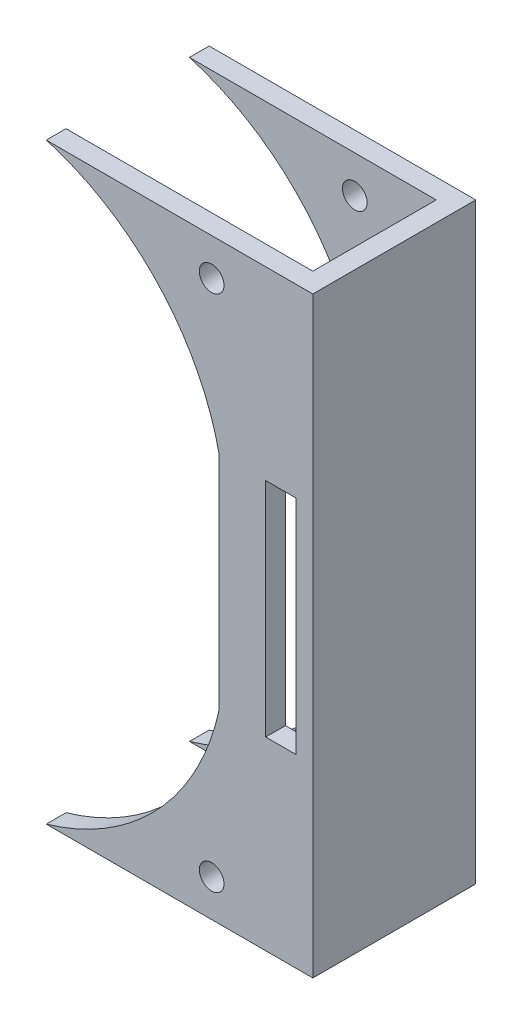
ISO-10303-21;
HEADER;
FILE_DESCRIPTION(('STEP AP214'),'2;1');
FILE_NAME('part.step','',(''),(''),'','','');
FILE_SCHEMA(('AUTOMOTIVE_DESIGN { 1 0 10303 214 1 1 1 1 }'));
ENDSEC;
DATA;
#1=APPLICATION_CONTEXT('core data for automotive mechanical design processes');
#2=APPLICATION_PROTOCOL_DEFINITION('international standard','automotive_design',2000,#1);
#3=PRODUCT_CONTEXT('',#1,'mechanical');
#4=PRODUCT('Part','Part','',(#3));
#5=PRODUCT_RELATED_PRODUCT_CATEGORY('part','',(#4));
#6=PRODUCT_DEFINITION_FORMATION('','',#4);
#7=PRODUCT_DEFINITION_CONTEXT('part definition',#1,'design');
#8=PRODUCT_DEFINITION('design','',#6,#7);
#9=PRODUCT_DEFINITION_SHAPE('','',#8);
#10=(LENGTH_UNIT() NAMED_UNIT(*) SI_UNIT(.MILLI.,.METRE.));
#11=(NAMED_UNIT(*) PLANE_ANGLE_UNIT() SI_UNIT($,.RADIAN.));
#12=(NAMED_UNIT(*) SI_UNIT($,.STERADIAN.) SOLID_ANGLE_UNIT());
#13=UNCERTAINTY_MEASURE_WITH_UNIT(LENGTH_MEASURE(1.E-05),#10,'distance_accuracy_value','');
#14=(GEOMETRIC_REPRESENTATION_CONTEXT(3) GLOBAL_UNCERTAINTY_ASSIGNED_CONTEXT((#13)) GLOBAL_UNIT_ASSIGNED_CONTEXT((#10,
#11,#12)) REPRESENTATION_CONTEXT('',''));
#15=CARTESIAN_POINT('',(0.,0.,0.));
#16=DIRECTION('',(0.,0.,1.));
#17=DIRECTION('',(1.,0.,0.));
#18=AXIS2_PLACEMENT_3D('',#15,#16,#17);
#19=CARTESIAN_POINT('',(27.3357664233577,0.,0.));
#20=DIRECTION('',(1.,0.,0.));
#21=DIRECTION('',(0.,1.,0.));
#22=AXIS2_PLACEMENT_3D('',#19,#20,#21);
#23=PLANE('',#22);
#24=DIRECTION('',(0.,-1.,0.));
#25=VECTOR('',#24,1.);
#26=CARTESIAN_POINT('',(27.3357664233577,0.,0.));
#27=LINE('',#26,#25);
#28=CARTESIAN_POINT('',(27.3357664233577,-22.5,0.));
#29=VERTEX_POINT('',#28);
#30=CARTESIAN_POINT('',(27.3357664233577,-60.,0.));
#31=VERTEX_POINT('',#30);
#32=EDGE_CURVE('E381',#29,#31,#27,.T.);
#33=ORIENTED_EDGE('',*,*,#32,.F.);
#34=DIRECTION('',(0.,0.,-1.));
#35=VECTOR('',#34,1.);
#36=CARTESIAN_POINT('',(27.3357664233577,-22.5,0.));
#37=LINE('',#36,#35);
#38=CARTESIAN_POINT('',(27.3357664233577,-22.5,-25.));
#39=VERTEX_POINT('',#38);
#40=EDGE_CURVE('E281',#29,#39,#37,.T.);
#41=ORIENTED_EDGE('',*,*,#40,.T.);
#42=DIRECTION('',(0.,-1.,0.));
#43=VECTOR('',#42,1.);
#44=CARTESIAN_POINT('',(27.3357664233577,0.,-25.));
#45=LINE('',#44,#43);
#46=CARTESIAN_POINT('',(27.3357664233577,-60.,-25.));
#47=VERTEX_POINT('',#46);
#48=EDGE_CURVE('E320',#39,#47,#45,.T.);
#49=ORIENTED_EDGE('',*,*,#48,.T.);
#50=DIRECTION('',(0.,0.,-1.));
#51=VECTOR('',#50,1.);
#52=CARTESIAN_POINT('',(27.3357664233577,-60.,4.));
#53=LINE('',#52,#51);
#54=EDGE_CURVE('E344',#31,#47,#53,.T.);
#55=ORIENTED_EDGE('',*,*,#54,.F.);
#56=EDGE_LOOP('',(#33,#41,#49,#55));
#57=FACE_BOUND('',#56,.T.);
#58=ADVANCED_FACE('F39',(#57),#23,.F.);
#59=CARTESIAN_POINT('',(27.3357664233576,60.,-25.));
#60=VERTEX_POINT('',#59);
#61=CARTESIAN_POINT('',(27.3357664233576,22.5,-25.));
#62=VERTEX_POINT('',#61);
#63=EDGE_CURVE('E321',#60,#62,#45,.T.);
#64=ORIENTED_EDGE('',*,*,#63,.T.);
#65=DIRECTION('',(0.,0.,1.));
#66=VECTOR('',#65,1.);
#67=CARTESIAN_POINT('',(27.3357664233576,22.5,0.));
#68=LINE('',#67,#66);
#69=CARTESIAN_POINT('',(27.3357664233576,22.5,0.));
#70=VERTEX_POINT('',#69);
#71=EDGE_CURVE('E262',#62,#70,#68,.T.);
#72=ORIENTED_EDGE('',*,*,#71,.T.);
#73=CARTESIAN_POINT('',(27.3357664233576,60.,0.));
#74=VERTEX_POINT('',#73);
#75=EDGE_CURVE('E382',#74,#70,#27,.T.);
#76=ORIENTED_EDGE('',*,*,#75,.F.);
#77=DIRECTION('',(0.,0.,1.));
#78=VECTOR('',#77,1.);
#79=CARTESIAN_POINT('',(27.3357664233576,60.,4.));
#80=LINE('',#79,#78);
#81=EDGE_CURVE('E349',#60,#74,#80,.T.);
#82=ORIENTED_EDGE('',*,*,#81,.F.);
#83=EDGE_LOOP('',(#64,#72,#76,#82));
#84=FACE_BOUND('',#83,.T.);
#85=ADVANCED_FACE('F428',(#84),#23,.F.);
#86=CARTESIAN_POINT('',(0.,-60.,4.));
#87=DIRECTION('',(0.,-1.,0.));
#88=DIRECTION('',(0.,0.,-1.));
#89=AXIS2_PLACEMENT_3D('',#86,#87,#88);
#90=PLANE('',#89);
#91=DIRECTION('',(-1.,0.,0.));
#92=VECTOR('',#91,1.);
#93=CARTESIAN_POINT('',(0.,-60.,0.));
#94=LINE('',#93,#92);
#95=CARTESIAN_POINT('',(-22.6642335766423,-60.,0.));
#96=VERTEX_POINT('',#95);
#97=EDGE_CURVE('E363',#31,#96,#94,.T.);
#98=ORIENTED_EDGE('',*,*,#97,.F.);
#99=ORIENTED_EDGE('',*,*,#54,.T.);
#100=DIRECTION('',(-1.,0.,0.));
#101=VECTOR('',#100,1.);
#102=CARTESIAN_POINT('',(0.,-60.,-25.));
#103=LINE('',#102,#101);
#104=CARTESIAN_POINT('',(-22.6642335766423,-60.,-25.));
#105=VERTEX_POINT('',#104);
#106=EDGE_CURVE('E307',#47,#105,#103,.T.);
#107=ORIENTED_EDGE('',*,*,#106,.T.);
#108=DIRECTION('',(0.,0.,1.));
#109=VECTOR('',#108,1.);
#110=CARTESIAN_POINT('',(-22.6642335766423,-60.,-29.));
#111=LINE('',#110,#109);
#112=CARTESIAN_POINT('',(-22.6642335766423,-60.,-29.));
#113=VERTEX_POINT('',#112);
#114=EDGE_CURVE('E317',#113,#105,#111,.T.);
#115=ORIENTED_EDGE('',*,*,#114,.F.);
#116=DIRECTION('',(-1.,0.,0.));
#117=VECTOR('',#116,1.);
#118=CARTESIAN_POINT('',(31.3357664233577,-60.,-29.));
#119=LINE('',#118,#117);
#120=CARTESIAN_POINT('',(31.3357664233577,-60.,-29.));
#121=VERTEX_POINT('',#120);
#122=EDGE_CURVE('E361',#121,#113,#119,.T.);
#123=ORIENTED_EDGE('',*,*,#122,.F.);
#124=DIRECTION('',(0.,0.,-1.));
#125=VECTOR('',#124,1.);
#126=CARTESIAN_POINT('',(31.3357664233577,-60.,4.));
#127=LINE('',#126,#125);
#128=CARTESIAN_POINT('',(31.3357664233577,-60.,4.));
#129=VERTEX_POINT('',#128);
#130=EDGE_CURVE('E348',#129,#121,#127,.T.);
#131=ORIENTED_EDGE('',*,*,#130,.F.);
#132=DIRECTION('',(-1.,0.,0.));
#133=VECTOR('',#132,1.);
#134=CARTESIAN_POINT('',(0.,-60.,4.));
#135=LINE('',#134,#133);
#136=CARTESIAN_POINT('',(-22.6642335766423,-60.,4.));
#137=VERTEX_POINT('',#136);
#138=EDGE_CURVE('E364',#129,#137,#135,.T.);
#139=ORIENTED_EDGE('',*,*,#138,.T.);
#140=DIRECTION('',(0.,0.,-1.));
#141=VECTOR('',#140,1.);
#142=CARTESIAN_POINT('',(-22.6642335766423,-60.,4.));
#143=LINE('',#142,#141);
#144=EDGE_CURVE('E378',#137,#96,#143,.T.);
#145=ORIENTED_EDGE('',*,*,#144,.T.);
#146=EDGE_LOOP('',(#98,#99,#107,#115,#123,#131,#139,#145));
#147=FACE_BOUND('',#146,.T.);
#148=ADVANCED_FACE('F41',(#147),#90,.T.);
#149=CARTESIAN_POINT('',(0.,60.,4.));
#150=DIRECTION('',(0.,1.,0.));
#151=DIRECTION('',(0.,0.,1.));
#152=AXIS2_PLACEMENT_3D('',#149,#150,#151);
#153=PLANE('',#152);
#154=DIRECTION('',(1.,0.,0.));
#155=VECTOR('',#154,1.);
#156=CARTESIAN_POINT('',(0.,60.,0.));
#157=LINE('',#156,#155);
#158=CARTESIAN_POINT('',(-22.6642335766424,60.,0.));
#159=VERTEX_POINT('',#158);
#160=EDGE_CURVE('E385',#159,#74,#157,.T.);
#161=ORIENTED_EDGE('',*,*,#160,.F.);
#162=DIRECTION('',(0.,0.,-1.));
#163=VECTOR('',#162,1.);
#164=CARTESIAN_POINT('',(-22.6642335766424,60.,4.));
#165=LINE('',#164,#163);
#166=CARTESIAN_POINT('',(-22.6642335766424,60.,4.));
#167=VERTEX_POINT('',#166);
#168=EDGE_CURVE('E401',#167,#159,#165,.T.);
#169=ORIENTED_EDGE('',*,*,#168,.F.);
#170=DIRECTION('',(1.,0.,0.));
#171=VECTOR('',#170,1.);
#172=CARTESIAN_POINT('',(0.,60.,4.));
#173=LINE('',#172,#171);
#174=CARTESIAN_POINT('',(31.3357664233576,60.,4.));
#175=VERTEX_POINT('',#174);
#176=EDGE_CURVE('E367',#167,#175,#173,.T.);
#177=ORIENTED_EDGE('',*,*,#176,.T.);
#178=DIRECTION('',(0.,0.,1.));
#179=VECTOR('',#178,1.);
#180=CARTESIAN_POINT('',(31.3357664233576,60.,4.));
#181=LINE('',#180,#179);
#182=CARTESIAN_POINT('',(31.3357664233576,60.,-29.));
#183=VERTEX_POINT('',#182);
#184=EDGE_CURVE('E353',#183,#175,#181,.T.);
#185=ORIENTED_EDGE('',*,*,#184,.F.);
#186=DIRECTION('',(-1.,0.,0.));
#187=VECTOR('',#186,1.);
#188=CARTESIAN_POINT('',(31.3357664233576,60.,-29.));
#189=LINE('',#188,#187);
#190=CARTESIAN_POINT('',(-22.6642335766424,60.,-29.));
#191=VERTEX_POINT('',#190);
#192=EDGE_CURVE('E356',#183,#191,#189,.T.);
#193=ORIENTED_EDGE('',*,*,#192,.T.);
#194=DIRECTION('',(0.,0.,1.));
#195=VECTOR('',#194,1.);
#196=CARTESIAN_POINT('',(-22.6642335766424,60.,-29.));
#197=LINE('',#196,#195);
#198=CARTESIAN_POINT('',(-22.6642335766424,60.,-25.));
#199=VERTEX_POINT('',#198);
#200=EDGE_CURVE('E341',#191,#199,#197,.T.);
#201=ORIENTED_EDGE('',*,*,#200,.T.);
#202=DIRECTION('',(1.,0.,0.));
#203=VECTOR('',#202,1.);
#204=CARTESIAN_POINT('',(0.,60.,-25.));
#205=LINE('',#204,#203);
#206=EDGE_CURVE('E324',#199,#60,#205,.T.);
#207=ORIENTED_EDGE('',*,*,#206,.T.);
#208=ORIENTED_EDGE('',*,*,#81,.T.);
#209=EDGE_LOOP('',(#161,#169,#177,#185,#193,#201,#207,#208));
#210=FACE_BOUND('',#209,.T.);
#211=ADVANCED_FACE('F435',(#210),#153,.T.);
#212=CARTESIAN_POINT('',(-36.6773985314371,11.8377127088582,4.));
#213=DIRECTION('',(0.,0.,-1.));
#214=DIRECTION('',(-1.,0.,0.));
#215=AXIS2_PLACEMENT_3D('',#212,#213,#214);
#216=CYLINDRICAL_SURFACE('',#215,50.1594927123946);
#217=CARTESIAN_POINT('',(-36.6773985314371,11.8377127088582,0.));
#218=DIRECTION('',(0.,0.,1.));
#219=DIRECTION('',(1.,0.,0.));
#220=AXIS2_PLACEMENT_3D('',#217,#218,#219);
#221=CIRCLE('',#220,50.1594927123946);
#222=CARTESIAN_POINT('',(12.3357664233576,22.5,0.));
#223=VERTEX_POINT('',#222);
#224=EDGE_CURVE('E388',#223,#159,#221,.T.);
#225=ORIENTED_EDGE('',*,*,#224,.F.);
#226=DIRECTION('',(0.,0.,-1.));
#227=VECTOR('',#226,1.);
#228=CARTESIAN_POINT('',(12.3357664233576,22.5,4.));
#229=LINE('',#228,#227);
#230=CARTESIAN_POINT('',(12.3357664233576,22.5,4.));
#231=VERTEX_POINT('',#230);
#232=EDGE_CURVE('E399',#231,#223,#229,.T.);
#233=ORIENTED_EDGE('',*,*,#232,.F.);
#234=CARTESIAN_POINT('',(-36.6773985314371,11.8377127088582,4.));
#235=DIRECTION('',(0.,0.,1.));
#236=DIRECTION('',(1.,0.,0.));
#237=AXIS2_PLACEMENT_3D('',#234,#235,#236);
#238=CIRCLE('',#237,50.1594927123946);
#239=EDGE_CURVE('E370',#231,#167,#238,.T.);
#240=ORIENTED_EDGE('',*,*,#239,.T.);
#241=ORIENTED_EDGE('',*,*,#168,.T.);
#242=EDGE_LOOP('',(#225,#233,#240,#241));
#243=FACE_BOUND('',#242,.T.);
#244=ADVANCED_FACE('F503',(#243),#216,.F.);
#245=CARTESIAN_POINT('',(12.3357664233576,0.,4.));
#246=DIRECTION('',(1.,0.,0.));
#247=DIRECTION('',(0.,1.,0.));
#248=AXIS2_PLACEMENT_3D('',#245,#246,#247);
#249=PLANE('',#248);
#250=DIRECTION('',(0.,-1.,0.));
#251=VECTOR('',#250,1.);
#252=CARTESIAN_POINT('',(12.3357664233576,0.,0.));
#253=LINE('',#252,#251);
#254=CARTESIAN_POINT('',(12.3357664233577,-22.5,0.));
#255=VERTEX_POINT('',#254);
#256=EDGE_CURVE('E391',#223,#255,#253,.T.);
#257=ORIENTED_EDGE('',*,*,#256,.T.);
#258=DIRECTION('',(0.,0.,-1.));
#259=VECTOR('',#258,1.);
#260=CARTESIAN_POINT('',(12.3357664233577,-22.5,4.));
#261=LINE('',#260,#259);
#262=CARTESIAN_POINT('',(12.3357664233577,-22.5,4.));
#263=VERTEX_POINT('',#262);
#264=EDGE_CURVE('E397',#263,#255,#261,.T.);
#265=ORIENTED_EDGE('',*,*,#264,.F.);
#266=DIRECTION('',(0.,-1.,0.));
#267=VECTOR('',#266,1.);
#268=CARTESIAN_POINT('',(12.3357664233576,0.,4.));
#269=LINE('',#268,#267);
#270=EDGE_CURVE('E373',#231,#263,#269,.T.);
#271=ORIENTED_EDGE('',*,*,#270,.F.);
#272=ORIENTED_EDGE('',*,*,#232,.T.);
#273=EDGE_LOOP('',(#257,#265,#271,#272));
#274=FACE_BOUND('',#273,.T.);
#275=ADVANCED_FACE('F499',(#274),#249,.F.);
#276=CARTESIAN_POINT('',(-36.6773985314372,-11.8377127088581,4.));
#277=DIRECTION('',(0.,0.,-1.));
#278=DIRECTION('',(-1.,0.,0.));
#279=AXIS2_PLACEMENT_3D('',#276,#277,#278);
#280=CYLINDRICAL_SURFACE('',#279,50.1594927123947);
#281=CARTESIAN_POINT('',(-36.6773985314372,-11.8377127088581,0.));
#282=DIRECTION('',(0.,0.,1.));
#283=DIRECTION('',(1.,0.,0.));
#284=AXIS2_PLACEMENT_3D('',#281,#282,#283);
#285=CIRCLE('',#284,50.1594927123947);
#286=EDGE_CURVE('E368',#96,#255,#285,.T.);
#287=ORIENTED_EDGE('',*,*,#286,.F.);
#288=ORIENTED_EDGE('',*,*,#144,.F.);
#289=CARTESIAN_POINT('',(-36.6773985314372,-11.8377127088581,4.));
#290=DIRECTION('',(0.,0.,1.));
#291=DIRECTION('',(1.,0.,0.));
#292=AXIS2_PLACEMENT_3D('',#289,#290,#291);
#293=CIRCLE('',#292,50.1594927123947);
#294=EDGE_CURVE('E375',#137,#263,#293,.T.);
#295=ORIENTED_EDGE('',*,*,#294,.T.);
#296=ORIENTED_EDGE('',*,*,#264,.T.);
#297=EDGE_LOOP('',(#287,#288,#295,#296));
#298=FACE_BOUND('',#297,.T.);
#299=ADVANCED_FACE('F493',(#298),#280,.F.);
#300=CARTESIAN_POINT('',(0.,0.,4.));
#301=DIRECTION('',(0.,0.,1.));
#302=DIRECTION('',(1.,0.,0.));
#303=AXIS2_PLACEMENT_3D('',#300,#301,#302);
#304=PLANE('',#303);
#305=DIRECTION('',(0.,1.,0.));
#306=VECTOR('',#305,1.);
#307=CARTESIAN_POINT('',(27.8871736605776,-22.5,4.));
#308=LINE('',#307,#306);
#309=CARTESIAN_POINT('',(27.8871736605776,-22.5,4.));
#310=VERTEX_POINT('',#309);
#311=CARTESIAN_POINT('',(27.8871736605776,22.5,4.));
#312=VERTEX_POINT('',#311);
#313=EDGE_CURVE('E233',#310,#312,#308,.T.);
#314=ORIENTED_EDGE('',*,*,#313,.F.);
#315=DIRECTION('',(1.,0.,0.));
#316=VECTOR('',#315,1.);
#317=CARTESIAN_POINT('',(21.7843591861376,-22.5,4.));
#318=LINE('',#317,#316);
#319=CARTESIAN_POINT('',(21.7843591861376,-22.5,4.));
#320=VERTEX_POINT('',#319);
#321=EDGE_CURVE('E241',#320,#310,#318,.T.);
#322=ORIENTED_EDGE('',*,*,#321,.F.);
#323=DIRECTION('',(0.,-1.,0.));
#324=VECTOR('',#323,1.);
#325=CARTESIAN_POINT('',(21.7843591861376,-22.5,4.));
#326=LINE('',#325,#324);
#327=CARTESIAN_POINT('',(21.7843591861376,22.5,4.));
#328=VERTEX_POINT('',#327);
#329=EDGE_CURVE('E255',#328,#320,#326,.T.);
#330=ORIENTED_EDGE('',*,*,#329,.F.);
#331=DIRECTION('',(-1.,0.,0.));
#332=VECTOR('',#331,1.);
#333=CARTESIAN_POINT('',(21.7843591861376,22.5,4.));
#334=LINE('',#333,#332);
#335=EDGE_CURVE('E252',#312,#328,#334,.T.);
#336=ORIENTED_EDGE('',*,*,#335,.F.);
#337=EDGE_LOOP('',(#314,#322,#330,#336));
#338=FACE_BOUND('',#337,.T.);
#339=CARTESIAN_POINT('',(10.8357664233576,-52.5,4.));
#340=DIRECTION('',(0.,0.,-1.));
#341=DIRECTION('',(1.,0.,0.));
#342=AXIS2_PLACEMENT_3D('',#339,#340,#341);
#343=CIRCLE('',#342,2.5);
#344=CARTESIAN_POINT('',(13.3357664233576,-52.5,4.));
#345=VERTEX_POINT('',#344);
#346=EDGE_CURVE('E287',#345,#345,#343,.T.);
#347=ORIENTED_EDGE('',*,*,#346,.T.);
#348=EDGE_LOOP('',(#347));
#349=FACE_BOUND('',#348,.T.);
#350=CARTESIAN_POINT('',(10.8357664233576,52.5,4.));
#351=DIRECTION('',(0.,0.,1.));
#352=DIRECTION('',(1.,0.,0.));
#353=AXIS2_PLACEMENT_3D('',#350,#351,#352);
#354=CIRCLE('',#353,2.5);
#355=CARTESIAN_POINT('',(13.3357664233576,52.5,4.));
#356=VERTEX_POINT('',#355);
#357=EDGE_CURVE('E297',#356,#356,#354,.T.);
#358=ORIENTED_EDGE('',*,*,#357,.F.);
#359=EDGE_LOOP('',(#358));
#360=FACE_BOUND('',#359,.T.);
#361=ORIENTED_EDGE('',*,*,#138,.F.);
#362=DIRECTION('',(0.,-1.,0.));
#363=VECTOR('',#362,1.);
#364=CARTESIAN_POINT('',(31.3357664233576,60.,4.));
#365=LINE('',#364,#363);
#366=EDGE_CURVE('E345',#175,#129,#365,.T.);
#367=ORIENTED_EDGE('',*,*,#366,.F.);
#368=ORIENTED_EDGE('',*,*,#176,.F.);
#369=ORIENTED_EDGE('',*,*,#239,.F.);
#370=ORIENTED_EDGE('',*,*,#270,.T.);
#371=ORIENTED_EDGE('',*,*,#294,.F.);
#372=EDGE_LOOP('',(#361,#367,#368,#369,#370,#371));
#373=FACE_BOUND('',#372,.T.);
#374=ADVANCED_FACE('F466',(#338,#349,#360,#373),#304,.T.);
#375=CARTESIAN_POINT('',(0.,0.,0.));
#376=DIRECTION('',(0.,0.,1.));
#377=DIRECTION('',(1.,0.,0.));
#378=AXIS2_PLACEMENT_3D('',#375,#376,#377);
#379=PLANE('',#378);
#380=CARTESIAN_POINT('',(10.8357664233576,-52.5,0.));
#381=DIRECTION('',(0.,0.,1.));
#382=DIRECTION('',(1.,0.,0.));
#383=AXIS2_PLACEMENT_3D('',#380,#381,#382);
#384=CIRCLE('',#383,2.5);
#385=CARTESIAN_POINT('',(13.3357664233576,-52.5,0.));
#386=VERTEX_POINT('',#385);
#387=EDGE_CURVE('E294',#386,#386,#384,.F.);
#388=ORIENTED_EDGE('',*,*,#387,.F.);
#389=EDGE_LOOP('',(#388));
#390=FACE_BOUND('',#389,.T.);
#391=CARTESIAN_POINT('',(10.8357664233576,52.5,0.));
#392=DIRECTION('',(0.,0.,1.));
#393=DIRECTION('',(1.,0.,0.));
#394=AXIS2_PLACEMENT_3D('',#391,#392,#393);
#395=CIRCLE('',#394,2.5);
#396=CARTESIAN_POINT('',(13.3357664233576,52.5,0.));
#397=VERTEX_POINT('',#396);
#398=EDGE_CURVE('E304',#397,#397,#395,.T.);
#399=ORIENTED_EDGE('',*,*,#398,.T.);
#400=EDGE_LOOP('',(#399));
#401=FACE_BOUND('',#400,.T.);
#402=DIRECTION('',(0.,-1.,0.));
#403=VECTOR('',#402,1.);
#404=CARTESIAN_POINT('',(21.7843591861376,0.,0.));
#405=LINE('',#404,#403);
#406=CARTESIAN_POINT('',(21.7843591861376,22.5,0.));
#407=VERTEX_POINT('',#406);
#408=CARTESIAN_POINT('',(21.7843591861376,-22.5,0.));
#409=VERTEX_POINT('',#408);
#410=EDGE_CURVE('E278',#407,#409,#405,.T.);
#411=ORIENTED_EDGE('',*,*,#410,.T.);
#412=DIRECTION('',(1.,0.,0.));
#413=VECTOR('',#412,1.);
#414=CARTESIAN_POINT('',(0.,-22.5,0.));
#415=LINE('',#414,#413);
#416=EDGE_CURVE('E284',#409,#29,#415,.T.);
#417=ORIENTED_EDGE('',*,*,#416,.T.);
#418=ORIENTED_EDGE('',*,*,#32,.T.);
#419=ORIENTED_EDGE('',*,*,#97,.T.);
#420=ORIENTED_EDGE('',*,*,#286,.T.);
#421=ORIENTED_EDGE('',*,*,#256,.F.);
#422=ORIENTED_EDGE('',*,*,#224,.T.);
#423=ORIENTED_EDGE('',*,*,#160,.T.);
#424=ORIENTED_EDGE('',*,*,#75,.T.);
#425=DIRECTION('',(-1.,0.,0.));
#426=VECTOR('',#425,1.);
#427=CARTESIAN_POINT('',(0.,22.5,0.));
#428=LINE('',#427,#426);
#429=EDGE_CURVE('E275',#70,#407,#428,.T.);
#430=ORIENTED_EDGE('',*,*,#429,.T.);
#431=EDGE_LOOP('',(#411,#417,#418,#419,#420,#421,#422,#423,#424,#430));
#432=FACE_BOUND('',#431,.T.);
#433=ADVANCED_FACE('F430',(#390,#401,#432),#379,.F.);
#434=CARTESIAN_POINT('',(31.3357664233576,60.,-29.));
#435=DIRECTION('',(0.,0.,1.));
#436=DIRECTION('',(0.,-1.,0.));
#437=AXIS2_PLACEMENT_3D('',#434,#435,#436);
#438=PLANE('',#437);
#439=DIRECTION('',(1.,0.,0.));
#440=VECTOR('',#439,1.);
#441=CARTESIAN_POINT('',(14.3357664233576,-41.5,-29.));
#442=LINE('',#441,#440);
#443=CARTESIAN_POINT('',(14.3357664233576,-41.5,-29.));
#444=VERTEX_POINT('',#443);
#445=CARTESIAN_POINT('',(21.8357664233576,-41.5,-29.));
#446=VERTEX_POINT('',#445);
#447=EDGE_CURVE('E208',#444,#446,#442,.T.);
#448=ORIENTED_EDGE('',*,*,#447,.T.);
#449=DIRECTION('',(0.,1.,0.));
#450=VECTOR('',#449,1.);
#451=CARTESIAN_POINT('',(21.8357664233576,-41.5,-29.));
#452=LINE('',#451,#450);
#453=CARTESIAN_POINT('',(21.8357664233576,-35.5,-29.));
#454=VERTEX_POINT('',#453);
#455=EDGE_CURVE('E202',#446,#454,#452,.T.);
#456=ORIENTED_EDGE('',*,*,#455,.T.);
#457=DIRECTION('',(-1.,0.,0.));
#458=VECTOR('',#457,1.);
#459=CARTESIAN_POINT('',(14.3357664233576,-35.5,-29.));
#460=LINE('',#459,#458);
#461=CARTESIAN_POINT('',(14.3357664233576,-35.5,-29.));
#462=VERTEX_POINT('',#461);
#463=EDGE_CURVE('E211',#454,#462,#460,.T.);
#464=ORIENTED_EDGE('',*,*,#463,.T.);
#465=DIRECTION('',(0.,-1.,0.));
#466=VECTOR('',#465,1.);
#467=CARTESIAN_POINT('',(14.3357664233576,-41.5,-29.));
#468=LINE('',#467,#466);
#469=EDGE_CURVE('E54',#462,#444,#468,.T.);
#470=ORIENTED_EDGE('',*,*,#469,.T.);
#471=EDGE_LOOP('',(#448,#456,#464,#470));
#472=FACE_BOUND('',#471,.T.);
#473=DIRECTION('',(1.,0.,0.));
#474=VECTOR('',#473,1.);
#475=CARTESIAN_POINT('',(21.7843591861376,-22.5,-29.));
#476=LINE('',#475,#474);
#477=CARTESIAN_POINT('',(21.7843591861376,-22.5,-29.));
#478=VERTEX_POINT('',#477);
#479=CARTESIAN_POINT('',(27.8871736605776,-22.5,-29.));
#480=VERTEX_POINT('',#479);
#481=EDGE_CURVE('E247',#478,#480,#476,.T.);
#482=ORIENTED_EDGE('',*,*,#481,.T.);
#483=DIRECTION('',(0.,1.,0.));
#484=VECTOR('',#483,1.);
#485=CARTESIAN_POINT('',(27.8871736605776,-22.5,-29.));
#486=LINE('',#485,#484);
#487=CARTESIAN_POINT('',(27.8871736605776,22.5,-29.));
#488=VERTEX_POINT('',#487);
#489=EDGE_CURVE('E237',#480,#488,#486,.T.);
#490=ORIENTED_EDGE('',*,*,#489,.T.);
#491=DIRECTION('',(-1.,0.,0.));
#492=VECTOR('',#491,1.);
#493=CARTESIAN_POINT('',(21.7843591861376,22.5,-29.));
#494=LINE('',#493,#492);
#495=CARTESIAN_POINT('',(21.7843591861376,22.5,-29.));
#496=VERTEX_POINT('',#495);
#497=EDGE_CURVE('E240',#488,#496,#494,.T.);
#498=ORIENTED_EDGE('',*,*,#497,.T.);
#499=DIRECTION('',(0.,-1.,0.));
#500=VECTOR('',#499,1.);
#501=CARTESIAN_POINT('',(21.7843591861376,-22.5,-29.));
#502=LINE('',#501,#500);
#503=EDGE_CURVE('E244',#496,#478,#502,.T.);
#504=ORIENTED_EDGE('',*,*,#503,.T.);
#505=EDGE_LOOP('',(#482,#490,#498,#504));
#506=FACE_BOUND('',#505,.T.);
#507=CARTESIAN_POINT('',(10.8357664233576,-52.5,-29.));
#508=DIRECTION('',(0.,0.,-1.));
#509=DIRECTION('',(1.,0.,0.));
#510=AXIS2_PLACEMENT_3D('',#507,#508,#509);
#511=CIRCLE('',#510,2.5);
#512=CARTESIAN_POINT('',(13.3357664233576,-52.5,-29.));
#513=VERTEX_POINT('',#512);
#514=EDGE_CURVE('E288',#513,#513,#511,.T.);
#515=ORIENTED_EDGE('',*,*,#514,.F.);
#516=EDGE_LOOP('',(#515));
#517=FACE_BOUND('',#516,.T.);
#518=CARTESIAN_POINT('',(10.8357664233576,52.5,-29.));
#519=DIRECTION('',(0.,0.,1.));
#520=DIRECTION('',(1.,0.,0.));
#521=AXIS2_PLACEMENT_3D('',#518,#519,#520);
#522=CIRCLE('',#521,2.5);
#523=CARTESIAN_POINT('',(13.3357664233576,52.5,-29.));
#524=VERTEX_POINT('',#523);
#525=EDGE_CURVE('E298',#524,#524,#522,.T.);
#526=ORIENTED_EDGE('',*,*,#525,.T.);
#527=EDGE_LOOP('',(#526));
#528=FACE_BOUND('',#527,.T.);
#529=ORIENTED_EDGE('',*,*,#122,.T.);
#530=CARTESIAN_POINT('',(-36.6773985314372,-11.8377127088581,-29.));
#531=DIRECTION('',(0.,0.,1.));
#532=DIRECTION('',(1.,0.,0.));
#533=AXIS2_PLACEMENT_3D('',#530,#531,#532);
#534=CIRCLE('',#533,50.1594927123947);
#535=CARTESIAN_POINT('',(12.3357664233577,-22.5,-29.));
#536=VERTEX_POINT('',#535);
#537=EDGE_CURVE('E315',#113,#536,#534,.T.);
#538=ORIENTED_EDGE('',*,*,#537,.T.);
#539=DIRECTION('',(0.,-1.,0.));
#540=VECTOR('',#539,1.);
#541=CARTESIAN_POINT('',(12.3357664233576,0.,-29.));
#542=LINE('',#541,#540);
#543=CARTESIAN_POINT('',(12.3357664233576,22.5,-29.));
#544=VERTEX_POINT('',#543);
#545=EDGE_CURVE('E311',#544,#536,#542,.T.);
#546=ORIENTED_EDGE('',*,*,#545,.F.);
#547=CARTESIAN_POINT('',(-36.6773985314371,11.8377127088582,-29.));
#548=DIRECTION('',(0.,0.,1.));
#549=DIRECTION('',(1.,0.,0.));
#550=AXIS2_PLACEMENT_3D('',#547,#548,#549);
#551=CIRCLE('',#550,50.1594927123946);
#552=EDGE_CURVE('E308',#544,#191,#551,.T.);
#553=ORIENTED_EDGE('',*,*,#552,.T.);
#554=ORIENTED_EDGE('',*,*,#192,.F.);
#555=DIRECTION('',(0.,1.,0.));
#556=VECTOR('',#555,1.);
#557=CARTESIAN_POINT('',(31.3357664233576,60.,-29.));
#558=LINE('',#557,#556);
#559=EDGE_CURVE('E351',#121,#183,#558,.T.);
#560=ORIENTED_EDGE('',*,*,#559,.F.);
#561=EDGE_LOOP('',(#529,#538,#546,#553,#554,#560));
#562=FACE_BOUND('',#561,.T.);
#563=ADVANCED_FACE('F215',(#472,#506,#517,#528,#562),#438,.F.);
#564=CARTESIAN_POINT('',(31.3357664233577,0.,0.));
#565=DIRECTION('',(1.,0.,0.));
#566=DIRECTION('',(0.,1.,0.));
#567=AXIS2_PLACEMENT_3D('',#564,#565,#566);
#568=PLANE('',#567);
#569=ORIENTED_EDGE('',*,*,#366,.T.);
#570=ORIENTED_EDGE('',*,*,#130,.T.);
#571=ORIENTED_EDGE('',*,*,#559,.T.);
#572=ORIENTED_EDGE('',*,*,#184,.T.);
#573=EDGE_LOOP('',(#569,#570,#571,#572));
#574=FACE_BOUND('',#573,.T.);
#575=ADVANCED_FACE('F487',(#574),#568,.T.);
#576=CARTESIAN_POINT('',(-36.6773985314371,11.8377127088582,-29.));
#577=DIRECTION('',(0.,0.,1.));
#578=DIRECTION('',(-1.,0.,0.));
#579=AXIS2_PLACEMENT_3D('',#576,#577,#578);
#580=CYLINDRICAL_SURFACE('',#579,50.1594927123946);
#581=CARTESIAN_POINT('',(-36.6773985314371,11.8377127088582,-25.));
#582=DIRECTION('',(0.,0.,1.));
#583=DIRECTION('',(1.,0.,0.));
#584=AXIS2_PLACEMENT_3D('',#581,#582,#583);
#585=CIRCLE('',#584,50.1594927123946);
#586=CARTESIAN_POINT('',(12.3357664233576,22.5,-25.));
#587=VERTEX_POINT('',#586);
#588=EDGE_CURVE('E327',#587,#199,#585,.T.);
#589=ORIENTED_EDGE('',*,*,#588,.T.);
#590=ORIENTED_EDGE('',*,*,#200,.F.);
#591=ORIENTED_EDGE('',*,*,#552,.F.);
#592=DIRECTION('',(0.,0.,1.));
#593=VECTOR('',#592,1.);
#594=CARTESIAN_POINT('',(12.3357664233576,22.5,-29.));
#595=LINE('',#594,#593);
#596=EDGE_CURVE('E338',#544,#587,#595,.T.);
#597=ORIENTED_EDGE('',*,*,#596,.T.);
#598=EDGE_LOOP('',(#589,#590,#591,#597));
#599=FACE_BOUND('',#598,.T.);
#600=ADVANCED_FACE('F441',(#599),#580,.F.);
#601=CARTESIAN_POINT('',(12.3357664233576,0.,-29.));
#602=DIRECTION('',(1.,0.,0.));
#603=DIRECTION('',(0.,1.,0.));
#604=AXIS2_PLACEMENT_3D('',#601,#602,#603);
#605=PLANE('',#604);
#606=DIRECTION('',(0.,-1.,0.));
#607=VECTOR('',#606,1.);
#608=CARTESIAN_POINT('',(12.3357664233576,0.,-25.));
#609=LINE('',#608,#607);
#610=CARTESIAN_POINT('',(12.3357664233577,-22.5,-25.));
#611=VERTEX_POINT('',#610);
#612=EDGE_CURVE('E329',#587,#611,#609,.T.);
#613=ORIENTED_EDGE('',*,*,#612,.F.);
#614=ORIENTED_EDGE('',*,*,#596,.F.);
#615=ORIENTED_EDGE('',*,*,#545,.T.);
#616=DIRECTION('',(0.,0.,1.));
#617=VECTOR('',#616,1.);
#618=CARTESIAN_POINT('',(12.3357664233577,-22.5,-29.));
#619=LINE('',#618,#617);
#620=EDGE_CURVE('E335',#536,#611,#619,.T.);
#621=ORIENTED_EDGE('',*,*,#620,.T.);
#622=EDGE_LOOP('',(#613,#614,#615,#621));
#623=FACE_BOUND('',#622,.T.);
#624=ADVANCED_FACE('F445',(#623),#605,.F.);
#625=CARTESIAN_POINT('',(-36.6773985314372,-11.8377127088581,-29.));
#626=DIRECTION('',(0.,0.,1.));
#627=DIRECTION('',(-1.,0.,0.));
#628=AXIS2_PLACEMENT_3D('',#625,#626,#627);
#629=CYLINDRICAL_SURFACE('',#628,50.1594927123947);
#630=CARTESIAN_POINT('',(-36.6773985314372,-11.8377127088581,-25.));
#631=DIRECTION('',(0.,0.,1.));
#632=DIRECTION('',(1.,0.,0.));
#633=AXIS2_PLACEMENT_3D('',#630,#631,#632);
#634=CIRCLE('',#633,50.1594927123947);
#635=EDGE_CURVE('E312',#105,#611,#634,.T.);
#636=ORIENTED_EDGE('',*,*,#635,.T.);
#637=ORIENTED_EDGE('',*,*,#620,.F.);
#638=ORIENTED_EDGE('',*,*,#537,.F.);
#639=ORIENTED_EDGE('',*,*,#114,.T.);
#640=EDGE_LOOP('',(#636,#637,#638,#639));
#641=FACE_BOUND('',#640,.T.);
#642=ADVANCED_FACE('F449',(#641),#629,.F.);
#643=CARTESIAN_POINT('',(0.,0.,-25.));
#644=DIRECTION('',(0.,0.,-1.));
#645=DIRECTION('',(1.,0.,0.));
#646=AXIS2_PLACEMENT_3D('',#643,#644,#645);
#647=PLANE('',#646);
#648=DIRECTION('',(-1.,0.,0.));
#649=VECTOR('',#648,1.);
#650=CARTESIAN_POINT('',(14.3357664233576,-35.5,-25.));
#651=LINE('',#650,#649);
#652=CARTESIAN_POINT('',(21.8357664233576,-35.5,-25.));
#653=VERTEX_POINT('',#652);
#654=CARTESIAN_POINT('',(14.3357664233576,-35.5,-25.));
#655=VERTEX_POINT('',#654);
#656=EDGE_CURVE('E227',#653,#655,#651,.T.);
#657=ORIENTED_EDGE('',*,*,#656,.F.);
#658=DIRECTION('',(0.,1.,0.));
#659=VECTOR('',#658,1.);
#660=CARTESIAN_POINT('',(21.8357664233576,-41.5,-25.));
#661=LINE('',#660,#659);
#662=CARTESIAN_POINT('',(21.8357664233576,-41.5,-25.));
#663=VERTEX_POINT('',#662);
#664=EDGE_CURVE('E62',#663,#653,#661,.T.);
#665=ORIENTED_EDGE('',*,*,#664,.F.);
#666=DIRECTION('',(1.,0.,0.));
#667=VECTOR('',#666,1.);
#668=CARTESIAN_POINT('',(14.3357664233576,-41.5,-25.));
#669=LINE('',#668,#667);
#670=CARTESIAN_POINT('',(14.3357664233576,-41.5,-25.));
#671=VERTEX_POINT('',#670);
#672=EDGE_CURVE('E218',#671,#663,#669,.T.);
#673=ORIENTED_EDGE('',*,*,#672,.F.);
#674=DIRECTION('',(0.,-1.,0.));
#675=VECTOR('',#674,1.);
#676=CARTESIAN_POINT('',(14.3357664233576,-41.5,-25.));
#677=LINE('',#676,#675);
#678=EDGE_CURVE('E221',#655,#671,#677,.T.);
#679=ORIENTED_EDGE('',*,*,#678,.F.);
#680=EDGE_LOOP('',(#657,#665,#673,#679));
#681=FACE_BOUND('',#680,.T.);
#682=CARTESIAN_POINT('',(10.8357664233576,-52.5,-25.));
#683=DIRECTION('',(0.,0.,-1.));
#684=DIRECTION('',(-1.,0.,0.));
#685=AXIS2_PLACEMENT_3D('',#682,#683,#684);
#686=CIRCLE('',#685,2.5);
#687=CARTESIAN_POINT('',(8.33576642335764,-52.5,-25.));
#688=VERTEX_POINT('',#687);
#689=EDGE_CURVE('E291',#688,#688,#686,.F.);
#690=ORIENTED_EDGE('',*,*,#689,.F.);
#691=EDGE_LOOP('',(#690));
#692=FACE_BOUND('',#691,.T.);
#693=CARTESIAN_POINT('',(10.8357664233576,52.5,-25.));
#694=DIRECTION('',(0.,0.,-1.));
#695=DIRECTION('',(-1.,0.,0.));
#696=AXIS2_PLACEMENT_3D('',#693,#694,#695);
#697=CIRCLE('',#696,2.5);
#698=CARTESIAN_POINT('',(8.33576642335764,52.5,-25.));
#699=VERTEX_POINT('',#698);
#700=EDGE_CURVE('E301',#699,#699,#697,.T.);
#701=ORIENTED_EDGE('',*,*,#700,.T.);
#702=EDGE_LOOP('',(#701));
#703=FACE_BOUND('',#702,.T.);
#704=ORIENTED_EDGE('',*,*,#48,.F.);
#705=DIRECTION('',(-1.,0.,0.));
#706=VECTOR('',#705,1.);
#707=CARTESIAN_POINT('',(0.,-22.5,-25.));
#708=LINE('',#707,#706);
#709=CARTESIAN_POINT('',(21.7843591861376,-22.5,-25.));
#710=VERTEX_POINT('',#709);
#711=EDGE_CURVE('E11',#39,#710,#708,.T.);
#712=ORIENTED_EDGE('',*,*,#711,.T.);
#713=DIRECTION('',(0.,1.,0.));
#714=VECTOR('',#713,1.);
#715=CARTESIAN_POINT('',(21.7843591861376,0.,-25.));
#716=LINE('',#715,#714);
#717=CARTESIAN_POINT('',(21.7843591861376,22.5,-25.));
#718=VERTEX_POINT('',#717);
#719=EDGE_CURVE('E47',#710,#718,#716,.T.);
#720=ORIENTED_EDGE('',*,*,#719,.T.);
#721=DIRECTION('',(1.,0.,0.));
#722=VECTOR('',#721,1.);
#723=CARTESIAN_POINT('',(0.,22.5,-25.));
#724=LINE('',#723,#722);
#725=EDGE_CURVE('E403',#718,#62,#724,.T.);
#726=ORIENTED_EDGE('',*,*,#725,.T.);
#727=ORIENTED_EDGE('',*,*,#63,.F.);
#728=ORIENTED_EDGE('',*,*,#206,.F.);
#729=ORIENTED_EDGE('',*,*,#588,.F.);
#730=ORIENTED_EDGE('',*,*,#612,.T.);
#731=ORIENTED_EDGE('',*,*,#635,.F.);
#732=ORIENTED_EDGE('',*,*,#106,.F.);
#733=EDGE_LOOP('',(#704,#712,#720,#726,#727,#728,#729,#730,#731,#732));
#734=FACE_BOUND('',#733,.T.);
#735=ADVANCED_FACE('F412',(#681,#692,#703,#734),#647,.F.);
#736=CARTESIAN_POINT('',(10.8357664233576,52.5,-29.));
#737=DIRECTION('',(0.,0.,1.));
#738=DIRECTION('',(1.,0.,0.));
#739=AXIS2_PLACEMENT_3D('',#736,#737,#738);
#740=CYLINDRICAL_SURFACE('',#739,2.5);
#741=ORIENTED_EDGE('',*,*,#525,.F.);
#742=EDGE_LOOP('',(#741));
#743=FACE_BOUND('',#742,.T.);
#744=ORIENTED_EDGE('',*,*,#700,.F.);
#745=EDGE_LOOP('',(#744));
#746=FACE_BOUND('',#745,.T.);
#747=ADVANCED_FACE('F592',(#743,#746),#740,.F.);
#748=ORIENTED_EDGE('',*,*,#357,.T.);
#749=EDGE_LOOP('',(#748));
#750=FACE_BOUND('',#749,.T.);
#751=ORIENTED_EDGE('',*,*,#398,.F.);
#752=EDGE_LOOP('',(#751));
#753=FACE_BOUND('',#752,.T.);
#754=ADVANCED_FACE('F639',(#750,#753),#740,.F.);
#755=CARTESIAN_POINT('',(10.8357664233576,-52.5,-29.));
#756=DIRECTION('',(0.,0.,1.));
#757=DIRECTION('',(1.,0.,0.));
#758=AXIS2_PLACEMENT_3D('',#755,#756,#757);
#759=CYLINDRICAL_SURFACE('',#758,2.5);
#760=ORIENTED_EDGE('',*,*,#514,.T.);
#761=EDGE_LOOP('',(#760));
#762=FACE_BOUND('',#761,.T.);
#763=ORIENTED_EDGE('',*,*,#689,.T.);
#764=EDGE_LOOP('',(#763));
#765=FACE_BOUND('',#764,.T.);
#766=ADVANCED_FACE('F645',(#762,#765),#759,.F.);
#767=ORIENTED_EDGE('',*,*,#346,.F.);
#768=EDGE_LOOP('',(#767));
#769=FACE_BOUND('',#768,.T.);
#770=ORIENTED_EDGE('',*,*,#387,.T.);
#771=EDGE_LOOP('',(#770));
#772=FACE_BOUND('',#771,.T.);
#773=ADVANCED_FACE('F548',(#769,#772),#759,.F.);
#774=CARTESIAN_POINT('',(21.7843591861376,-22.5,-29.));
#775=DIRECTION('',(0.,-1.,0.));
#776=DIRECTION('',(0.,0.,-1.));
#777=AXIS2_PLACEMENT_3D('',#774,#775,#776);
#778=PLANE('',#777);
#779=DIRECTION('',(0.,0.,1.));
#780=VECTOR('',#779,1.);
#781=CARTESIAN_POINT('',(21.7843591861376,-22.5,-29.));
#782=LINE('',#781,#780);
#783=EDGE_CURVE('E266',#409,#320,#782,.T.);
#784=ORIENTED_EDGE('',*,*,#783,.T.);
#785=ORIENTED_EDGE('',*,*,#321,.T.);
#786=DIRECTION('',(0.,0.,1.));
#787=VECTOR('',#786,1.);
#788=CARTESIAN_POINT('',(27.8871736605776,-22.5,-29.));
#789=LINE('',#788,#787);
#790=EDGE_CURVE('E260',#480,#310,#789,.T.);
#791=ORIENTED_EDGE('',*,*,#790,.F.);
#792=ORIENTED_EDGE('',*,*,#481,.F.);
#793=EDGE_CURVE('E263',#478,#710,#782,.T.);
#794=ORIENTED_EDGE('',*,*,#793,.T.);
#795=ORIENTED_EDGE('',*,*,#711,.F.);
#796=ORIENTED_EDGE('',*,*,#40,.F.);
#797=ORIENTED_EDGE('',*,*,#416,.F.);
#798=EDGE_LOOP('',(#784,#785,#791,#792,#794,#795,#796,#797));
#799=FACE_BOUND('',#798,.T.);
#800=ADVANCED_FACE('F419',(#799),#778,.F.);
#801=CARTESIAN_POINT('',(21.7843591861376,-22.5,-29.));
#802=DIRECTION('',(-1.,0.,0.));
#803=DIRECTION('',(0.,0.,1.));
#804=AXIS2_PLACEMENT_3D('',#801,#802,#803);
#805=PLANE('',#804);
#806=DIRECTION('',(0.,0.,1.));
#807=VECTOR('',#806,1.);
#808=CARTESIAN_POINT('',(21.7843591861376,22.5,-29.));
#809=LINE('',#808,#807);
#810=EDGE_CURVE('E270',#407,#328,#809,.T.);
#811=ORIENTED_EDGE('',*,*,#810,.T.);
#812=ORIENTED_EDGE('',*,*,#329,.T.);
#813=ORIENTED_EDGE('',*,*,#783,.F.);
#814=ORIENTED_EDGE('',*,*,#410,.F.);
#815=EDGE_LOOP('',(#811,#812,#813,#814));
#816=FACE_BOUND('',#815,.T.);
#817=ADVANCED_FACE('F460',(#816),#805,.F.);
#818=ORIENTED_EDGE('',*,*,#793,.F.);
#819=ORIENTED_EDGE('',*,*,#503,.F.);
#820=EDGE_CURVE('E267',#496,#718,#809,.T.);
#821=ORIENTED_EDGE('',*,*,#820,.T.);
#822=ORIENTED_EDGE('',*,*,#719,.F.);
#823=EDGE_LOOP('',(#818,#819,#821,#822));
#824=FACE_BOUND('',#823,.T.);
#825=ADVANCED_FACE('F415',(#824),#805,.F.);
#826=CARTESIAN_POINT('',(21.7843591861376,22.5,-29.));
#827=DIRECTION('',(0.,1.,0.));
#828=DIRECTION('',(0.,0.,1.));
#829=AXIS2_PLACEMENT_3D('',#826,#827,#828);
#830=PLANE('',#829);
#831=ORIENTED_EDGE('',*,*,#71,.F.);
#832=ORIENTED_EDGE('',*,*,#725,.F.);
#833=ORIENTED_EDGE('',*,*,#820,.F.);
#834=ORIENTED_EDGE('',*,*,#497,.F.);
#835=DIRECTION('',(0.,0.,1.));
#836=VECTOR('',#835,1.);
#837=CARTESIAN_POINT('',(27.8871736605776,22.5,-29.));
#838=LINE('',#837,#836);
#839=EDGE_CURVE('E250',#488,#312,#838,.T.);
#840=ORIENTED_EDGE('',*,*,#839,.T.);
#841=ORIENTED_EDGE('',*,*,#335,.T.);
#842=ORIENTED_EDGE('',*,*,#810,.F.);
#843=ORIENTED_EDGE('',*,*,#429,.F.);
#844=EDGE_LOOP('',(#831,#832,#833,#834,#840,#841,#842,#843));
#845=FACE_BOUND('',#844,.T.);
#846=ADVANCED_FACE('F424',(#845),#830,.F.);
#847=CARTESIAN_POINT('',(27.8871736605776,-22.5,-29.));
#848=DIRECTION('',(1.,0.,0.));
#849=DIRECTION('',(0.,0.,-1.));
#850=AXIS2_PLACEMENT_3D('',#847,#848,#849);
#851=PLANE('',#850);
#852=ORIENTED_EDGE('',*,*,#313,.T.);
#853=ORIENTED_EDGE('',*,*,#839,.F.);
#854=ORIENTED_EDGE('',*,*,#489,.F.);
#855=ORIENTED_EDGE('',*,*,#790,.T.);
#856=EDGE_LOOP('',(#852,#853,#854,#855));
#857=FACE_BOUND('',#856,.T.);
#858=ADVANCED_FACE('F469',(#857),#851,.F.);
#859=CARTESIAN_POINT('',(21.8357664233576,-41.5,-29.));
#860=DIRECTION('',(1.,0.,0.));
#861=DIRECTION('',(0.,0.,-1.));
#862=AXIS2_PLACEMENT_3D('',#859,#860,#861);
#863=PLANE('',#862);
#864=ORIENTED_EDGE('',*,*,#664,.T.);
#865=DIRECTION('',(0.,0.,1.));
#866=VECTOR('',#865,1.);
#867=CARTESIAN_POINT('',(21.8357664233576,-35.5,-29.));
#868=LINE('',#867,#866);
#869=EDGE_CURVE('E198',#454,#653,#868,.T.);
#870=ORIENTED_EDGE('',*,*,#869,.F.);
#871=ORIENTED_EDGE('',*,*,#455,.F.);
#872=DIRECTION('',(0.,0.,1.));
#873=VECTOR('',#872,1.);
#874=CARTESIAN_POINT('',(21.8357664233576,-41.5,-29.));
#875=LINE('',#874,#873);
#876=EDGE_CURVE('E231',#446,#663,#875,.T.);
#877=ORIENTED_EDGE('',*,*,#876,.T.);
#878=EDGE_LOOP('',(#864,#870,#871,#877));
#879=FACE_BOUND('',#878,.T.);
#880=ADVANCED_FACE('F200',(#879),#863,.F.);
#881=CARTESIAN_POINT('',(14.3357664233576,-41.5,-29.));
#882=DIRECTION('',(0.,-1.,0.));
#883=DIRECTION('',(0.,0.,-1.));
#884=AXIS2_PLACEMENT_3D('',#881,#882,#883);
#885=PLANE('',#884);
#886=ORIENTED_EDGE('',*,*,#672,.T.);
#887=ORIENTED_EDGE('',*,*,#876,.F.);
#888=ORIENTED_EDGE('',*,*,#447,.F.);
#889=DIRECTION('',(0.,0.,1.));
#890=VECTOR('',#889,1.);
#891=CARTESIAN_POINT('',(14.3357664233576,-41.5,-29.));
#892=LINE('',#891,#890);
#893=EDGE_CURVE('E234',#444,#671,#892,.T.);
#894=ORIENTED_EDGE('',*,*,#893,.T.);
#895=EDGE_LOOP('',(#886,#887,#888,#894));
#896=FACE_BOUND('',#895,.T.);
#897=ADVANCED_FACE('F476',(#896),#885,.F.);
#898=CARTESIAN_POINT('',(14.3357664233576,-41.5,-29.));
#899=DIRECTION('',(-1.,0.,0.));
#900=DIRECTION('',(0.,0.,1.));
#901=AXIS2_PLACEMENT_3D('',#898,#899,#900);
#902=PLANE('',#901);
#903=ORIENTED_EDGE('',*,*,#678,.T.);
#904=ORIENTED_EDGE('',*,*,#893,.F.);
#905=ORIENTED_EDGE('',*,*,#469,.F.);
#906=DIRECTION('',(0.,0.,1.));
#907=VECTOR('',#906,1.);
#908=CARTESIAN_POINT('',(14.3357664233576,-35.5,-29.));
#909=LINE('',#908,#907);
#910=EDGE_CURVE('E207',#462,#655,#909,.T.);
#911=ORIENTED_EDGE('',*,*,#910,.T.);
#912=EDGE_LOOP('',(#903,#904,#905,#911));
#913=FACE_BOUND('',#912,.T.);
#914=ADVANCED_FACE('F611',(#913),#902,.F.);
#915=CARTESIAN_POINT('',(14.3357664233576,-35.5,-29.));
#916=DIRECTION('',(0.,1.,0.));
#917=DIRECTION('',(0.,0.,1.));
#918=AXIS2_PLACEMENT_3D('',#915,#916,#917);
#919=PLANE('',#918);
#920=ORIENTED_EDGE('',*,*,#656,.T.);
#921=ORIENTED_EDGE('',*,*,#910,.F.);
#922=ORIENTED_EDGE('',*,*,#463,.F.);
#923=ORIENTED_EDGE('',*,*,#869,.T.);
#924=EDGE_LOOP('',(#920,#921,#922,#923));
#925=FACE_BOUND('',#924,.T.);
#926=ADVANCED_FACE('F212',(#925),#919,.F.);
#927=CLOSED_SHELL('',(#58,#85,#148,#211,#244,#275,#299,#374,#433,#563,#575,#600,#624,#642,#735,
#747,#754,#766,#773,#800,#817,#825,#846,#858,#880,#897,#914,#926));
#928=MANIFOLD_SOLID_BREP('B2',#927);
#929=ADVANCED_BREP_SHAPE_REPRESENTATION('',(#18,#928),#14);
#930=SHAPE_DEFINITION_REPRESENTATION(#9,#929);
ENDSEC;
END-ISO-10303-21;
